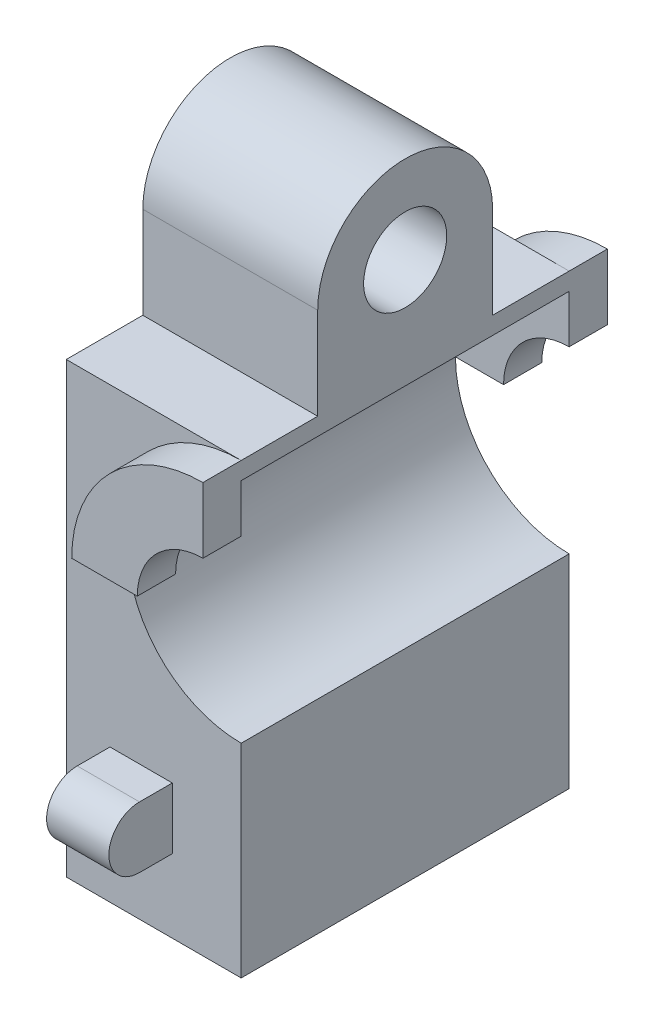
ISO-10303-21;
HEADER;
FILE_DESCRIPTION(('STEP AP214'),'2;1');
FILE_NAME('part.step','',(''),(''),'','','');
FILE_SCHEMA(('AUTOMOTIVE_DESIGN { 1 0 10303 214 1 1 1 1 }'));
ENDSEC;
DATA;
#1=APPLICATION_CONTEXT('core data for automotive mechanical design processes');
#2=APPLICATION_PROTOCOL_DEFINITION('international standard','automotive_design',2000,#1);
#3=PRODUCT_CONTEXT('',#1,'mechanical');
#4=PRODUCT('Part','Part','',(#3));
#5=PRODUCT_RELATED_PRODUCT_CATEGORY('part','',(#4));
#6=PRODUCT_DEFINITION_FORMATION('','',#4);
#7=PRODUCT_DEFINITION_CONTEXT('part definition',#1,'design');
#8=PRODUCT_DEFINITION('design','',#6,#7);
#9=PRODUCT_DEFINITION_SHAPE('','',#8);
#10=(LENGTH_UNIT() NAMED_UNIT(*) SI_UNIT(.MILLI.,.METRE.));
#11=(NAMED_UNIT(*) PLANE_ANGLE_UNIT() SI_UNIT($,.RADIAN.));
#12=(NAMED_UNIT(*) SI_UNIT($,.STERADIAN.) SOLID_ANGLE_UNIT());
#13=UNCERTAINTY_MEASURE_WITH_UNIT(LENGTH_MEASURE(1.E-05),#10,'distance_accuracy_value','');
#14=(GEOMETRIC_REPRESENTATION_CONTEXT(3) GLOBAL_UNCERTAINTY_ASSIGNED_CONTEXT((#13)) GLOBAL_UNIT_ASSIGNED_CONTEXT((#10,
#11,#12)) REPRESENTATION_CONTEXT('',''));
#15=CARTESIAN_POINT('',(0.,0.,0.));
#16=DIRECTION('',(0.,0.,1.));
#17=DIRECTION('',(1.,0.,0.));
#18=AXIS2_PLACEMENT_3D('',#15,#16,#17);
#19=CARTESIAN_POINT('',(0.,0.,15.));
#20=DIRECTION('',(0.,0.,-1.));
#21=DIRECTION('',(-1.,0.,0.));
#22=AXIS2_PLACEMENT_3D('',#19,#20,#21);
#23=CYLINDRICAL_SURFACE('',#22,6.);
#24=CARTESIAN_POINT('',(0.,0.,15.));
#25=DIRECTION('',(0.,0.,1.));
#26=DIRECTION('',(1.,0.,0.));
#27=AXIS2_PLACEMENT_3D('',#24,#25,#26);
#28=CIRCLE('',#27,6.);
#29=CARTESIAN_POINT('',(-6.,0.,15.));
#30=VERTEX_POINT('',#29);
#31=CARTESIAN_POINT('',(0.,6.,15.));
#32=VERTEX_POINT('',#31);
#33=EDGE_CURVE('E228',#30,#32,#28,.F.);
#34=ORIENTED_EDGE('',*,*,#33,.F.);
#35=DIRECTION('',(0.,0.,1.));
#36=VECTOR('',#35,1.);
#37=CARTESIAN_POINT('',(-6.,0.,15.));
#38=LINE('',#37,#36);
#39=CARTESIAN_POINT('',(-6.,0.,16.75));
#40=VERTEX_POINT('',#39);
#41=EDGE_CURVE('E289',#30,#40,#38,.T.);
#42=ORIENTED_EDGE('',*,*,#41,.T.);
#43=CARTESIAN_POINT('',(0.,0.,16.75));
#44=DIRECTION('',(0.,0.,-1.));
#45=DIRECTION('',(-1.,0.,0.));
#46=AXIS2_PLACEMENT_3D('',#43,#44,#45);
#47=CIRCLE('',#46,6.);
#48=CARTESIAN_POINT('',(0.,6.,16.75));
#49=VERTEX_POINT('',#48);
#50=EDGE_CURVE('E302',#40,#49,#47,.T.);
#51=ORIENTED_EDGE('',*,*,#50,.T.);
#52=DIRECTION('',(0.,0.,-1.));
#53=VECTOR('',#52,1.);
#54=CARTESIAN_POINT('',(0.,6.,15.));
#55=LINE('',#54,#53);
#56=EDGE_CURVE('E11',#49,#32,#55,.T.);
#57=ORIENTED_EDGE('',*,*,#56,.T.);
#58=EDGE_LOOP('',(#34,#42,#51,#57));
#59=FACE_BOUND('',#58,.T.);
#60=ADVANCED_FACE('F47',(#59),#23,.T.);
#61=CARTESIAN_POINT('',(0.,0.,0.));
#62=DIRECTION('',(0.,0.,-1.));
#63=DIRECTION('',(-1.,0.,0.));
#64=AXIS2_PLACEMENT_3D('',#61,#62,#63);
#65=CIRCLE('',#64,6.);
#66=CARTESIAN_POINT('',(0.,6.,0.));
#67=VERTEX_POINT('',#66);
#68=CARTESIAN_POINT('',(-6.,0.,0.));
#69=VERTEX_POINT('',#68);
#70=EDGE_CURVE('E70',#67,#69,#65,.F.);
#71=ORIENTED_EDGE('',*,*,#70,.F.);
#72=CARTESIAN_POINT('',(0.,6.,-1.75));
#73=VERTEX_POINT('',#72);
#74=EDGE_CURVE('E56',#67,#73,#55,.T.);
#75=ORIENTED_EDGE('',*,*,#74,.T.);
#76=CARTESIAN_POINT('',(0.,0.,-1.75));
#77=DIRECTION('',(0.,0.,-1.));
#78=DIRECTION('',(-1.,0.,0.));
#79=AXIS2_PLACEMENT_3D('',#76,#77,#78);
#80=CIRCLE('',#79,6.);
#81=CARTESIAN_POINT('',(-6.,0.,-1.75));
#82=VERTEX_POINT('',#81);
#83=EDGE_CURVE('E327',#82,#73,#80,.T.);
#84=ORIENTED_EDGE('',*,*,#83,.F.);
#85=DIRECTION('',(0.,0.,1.));
#86=VECTOR('',#85,1.);
#87=CARTESIAN_POINT('',(-6.,0.,0.));
#88=LINE('',#87,#86);
#89=EDGE_CURVE('E319',#82,#69,#88,.T.);
#90=ORIENTED_EDGE('',*,*,#89,.T.);
#91=EDGE_LOOP('',(#71,#75,#84,#90));
#92=FACE_BOUND('',#91,.T.);
#93=ADVANCED_FACE('F488',(#92),#23,.T.);
#94=CARTESIAN_POINT('',(-6.,-14.5,15.));
#95=DIRECTION('',(1.,0.,0.));
#96=DIRECTION('',(0.,0.,-1.));
#97=AXIS2_PLACEMENT_3D('',#94,#95,#96);
#98=PLANE('',#97);
#99=DIRECTION('',(0.,-1.,0.));
#100=VECTOR('',#99,1.);
#101=CARTESIAN_POINT('',(-6.,0.,0.));
#102=LINE('',#101,#100);
#103=CARTESIAN_POINT('',(-6.,-8.35,0.));
#104=VERTEX_POINT('',#103);
#105=CARTESIAN_POINT('',(-6.,-11.15,0.));
#106=VERTEX_POINT('',#105);
#107=EDGE_CURVE('E248',#104,#106,#102,.T.);
#108=ORIENTED_EDGE('',*,*,#107,.F.);
#109=DIRECTION('',(0.,0.,-1.));
#110=VECTOR('',#109,1.);
#111=CARTESIAN_POINT('',(-6.,-8.35,0.));
#112=LINE('',#111,#110);
#113=CARTESIAN_POINT('',(-6.,-8.35,-1.5));
#114=VERTEX_POINT('',#113);
#115=EDGE_CURVE('E372',#104,#114,#112,.T.);
#116=ORIENTED_EDGE('',*,*,#115,.T.);
#117=CARTESIAN_POINT('',(-6.,-9.75,-1.5));
#118=DIRECTION('',(-1.,0.,0.));
#119=DIRECTION('',(0.,0.,1.));
#120=AXIS2_PLACEMENT_3D('',#117,#118,#119);
#121=CIRCLE('',#120,1.4);
#122=CARTESIAN_POINT('',(-6.,-11.15,-1.5));
#123=VERTEX_POINT('',#122);
#124=EDGE_CURVE('E375',#114,#123,#121,.T.);
#125=ORIENTED_EDGE('',*,*,#124,.T.);
#126=DIRECTION('',(0.,0.,-1.));
#127=VECTOR('',#126,1.);
#128=CARTESIAN_POINT('',(-6.,-11.15,0.));
#129=LINE('',#128,#127);
#130=EDGE_CURVE('E364',#106,#123,#129,.T.);
#131=ORIENTED_EDGE('',*,*,#130,.F.);
#132=EDGE_LOOP('',(#108,#116,#125,#131));
#133=FACE_BOUND('',#132,.T.);
#134=ADVANCED_FACE('F490',(#133),#98,.F.);
#135=DIRECTION('',(0.,1.,0.));
#136=VECTOR('',#135,1.);
#137=CARTESIAN_POINT('',(-6.,0.,15.));
#138=LINE('',#137,#136);
#139=CARTESIAN_POINT('',(-6.,-11.15,15.));
#140=VERTEX_POINT('',#139);
#141=CARTESIAN_POINT('',(-6.,-8.35,15.));
#142=VERTEX_POINT('',#141);
#143=EDGE_CURVE('E245',#140,#142,#138,.T.);
#144=ORIENTED_EDGE('',*,*,#143,.F.);
#145=DIRECTION('',(0.,0.,1.));
#146=VECTOR('',#145,1.);
#147=CARTESIAN_POINT('',(-6.,-11.15,0.));
#148=LINE('',#147,#146);
#149=CARTESIAN_POINT('',(-6.,-11.15,16.5));
#150=VERTEX_POINT('',#149);
#151=EDGE_CURVE('E393',#140,#150,#148,.T.);
#152=ORIENTED_EDGE('',*,*,#151,.T.);
#153=CARTESIAN_POINT('',(-6.,-9.75,16.5));
#154=DIRECTION('',(-1.,0.,0.));
#155=DIRECTION('',(0.,0.,1.));
#156=AXIS2_PLACEMENT_3D('',#153,#154,#155);
#157=CIRCLE('',#156,1.4);
#158=CARTESIAN_POINT('',(-6.,-8.35,16.5));
#159=VERTEX_POINT('',#158);
#160=EDGE_CURVE('E352',#159,#150,#157,.F.);
#161=ORIENTED_EDGE('',*,*,#160,.F.);
#162=DIRECTION('',(0.,0.,1.));
#163=VECTOR('',#162,1.);
#164=CARTESIAN_POINT('',(-6.,-8.35000000000002,0.));
#165=LINE('',#164,#163);
#166=EDGE_CURVE('E403',#142,#159,#165,.T.);
#167=ORIENTED_EDGE('',*,*,#166,.F.);
#168=EDGE_LOOP('',(#144,#152,#161,#167));
#169=FACE_BOUND('',#168,.T.);
#170=ADVANCED_FACE('F495',(#169),#98,.F.);
#171=CARTESIAN_POINT('',(-6.,-14.501,11.5));
#172=DIRECTION('',(0.,0.,-1.));
#173=DIRECTION('',(-1.,0.,0.));
#174=AXIS2_PLACEMENT_3D('',#171,#172,#173);
#175=PLANE('',#174);
#176=DIRECTION('',(-1.,0.,0.));
#177=VECTOR('',#176,1.);
#178=CARTESIAN_POINT('',(0.00200000000000027,6.,11.5));
#179=LINE('',#178,#177);
#180=CARTESIAN_POINT('',(0.,6.,11.5));
#181=VERTEX_POINT('',#180);
#182=CARTESIAN_POINT('',(-8.,6.,11.5));
#183=VERTEX_POINT('',#182);
#184=EDGE_CURVE('E220',#181,#183,#179,.T.);
#185=ORIENTED_EDGE('',*,*,#184,.F.);
#186=DIRECTION('',(0.,1.,0.));
#187=VECTOR('',#186,1.);
#188=CARTESIAN_POINT('',(0.,0.,11.5));
#189=LINE('',#188,#187);
#190=CARTESIAN_POINT('',(0.,10.2,11.5));
#191=VERTEX_POINT('',#190);
#192=EDGE_CURVE('E346',#181,#191,#189,.T.);
#193=ORIENTED_EDGE('',*,*,#192,.T.);
#194=DIRECTION('',(1.,0.,0.));
#195=VECTOR('',#194,1.);
#196=CARTESIAN_POINT('',(-17.4560027932957,10.2,11.5));
#197=LINE('',#196,#195);
#198=CARTESIAN_POINT('',(-8.,10.2,11.5));
#199=VERTEX_POINT('',#198);
#200=EDGE_CURVE('E233',#199,#191,#197,.T.);
#201=ORIENTED_EDGE('',*,*,#200,.F.);
#202=DIRECTION('',(0.,1.,0.));
#203=VECTOR('',#202,1.);
#204=CARTESIAN_POINT('',(-8.,0.,11.5));
#205=LINE('',#204,#203);
#206=EDGE_CURVE('E231',#183,#199,#205,.T.);
#207=ORIENTED_EDGE('',*,*,#206,.F.);
#208=EDGE_LOOP('',(#185,#193,#201,#207));
#209=FACE_BOUND('',#208,.T.);
#210=ADVANCED_FACE('F232',(#209),#175,.F.);
#211=CARTESIAN_POINT('',(0.,-14.501,3.5));
#212=DIRECTION('',(0.,0.,1.));
#213=DIRECTION('',(1.,0.,0.));
#214=AXIS2_PLACEMENT_3D('',#211,#212,#213);
#215=PLANE('',#214);
#216=DIRECTION('',(0.,1.,0.));
#217=VECTOR('',#216,1.);
#218=CARTESIAN_POINT('',(0.,0.,3.5));
#219=LINE('',#218,#217);
#220=CARTESIAN_POINT('',(0.,6.,3.5));
#221=VERTEX_POINT('',#220);
#222=CARTESIAN_POINT('',(0.,10.2,3.5));
#223=VERTEX_POINT('',#222);
#224=EDGE_CURVE('E353',#221,#223,#219,.T.);
#225=ORIENTED_EDGE('',*,*,#224,.F.);
#226=DIRECTION('',(1.,0.,0.));
#227=VECTOR('',#226,1.);
#228=CARTESIAN_POINT('',(-8.,6.,3.5));
#229=LINE('',#228,#227);
#230=CARTESIAN_POINT('',(-8.,6.,3.5));
#231=VERTEX_POINT('',#230);
#232=EDGE_CURVE('E273',#231,#221,#229,.T.);
#233=ORIENTED_EDGE('',*,*,#232,.F.);
#234=DIRECTION('',(0.,-1.,0.));
#235=VECTOR('',#234,1.);
#236=CARTESIAN_POINT('',(-8.,0.,3.5));
#237=LINE('',#236,#235);
#238=CARTESIAN_POINT('',(-8.,10.2,3.5));
#239=VERTEX_POINT('',#238);
#240=EDGE_CURVE('E253',#239,#231,#237,.T.);
#241=ORIENTED_EDGE('',*,*,#240,.F.);
#242=DIRECTION('',(1.,0.,0.));
#243=VECTOR('',#242,1.);
#244=CARTESIAN_POINT('',(-17.4560027932957,10.2,3.5));
#245=LINE('',#244,#243);
#246=EDGE_CURVE('E345',#239,#223,#245,.T.);
#247=ORIENTED_EDGE('',*,*,#246,.T.);
#248=EDGE_LOOP('',(#225,#233,#241,#247));
#249=FACE_BOUND('',#248,.T.);
#250=ADVANCED_FACE('F510',(#249),#215,.F.);
#251=CARTESIAN_POINT('',(0.,0.,15.));
#252=DIRECTION('',(0.,0.,1.));
#253=DIRECTION('',(1.,0.,0.));
#254=AXIS2_PLACEMENT_3D('',#251,#252,#253);
#255=PLANE('',#254);
#256=DIRECTION('',(0.,1.,0.));
#257=VECTOR('',#256,1.);
#258=CARTESIAN_POINT('',(-8.,0.,15.));
#259=LINE('',#258,#257);
#260=CARTESIAN_POINT('',(-8.,-14.5,15.));
#261=VERTEX_POINT('',#260);
#262=CARTESIAN_POINT('',(-8.,6.,15.));
#263=VERTEX_POINT('',#262);
#264=EDGE_CURVE('E243',#261,#263,#259,.T.);
#265=ORIENTED_EDGE('',*,*,#264,.F.);
#266=DIRECTION('',(1.,0.,0.));
#267=VECTOR('',#266,1.);
#268=CARTESIAN_POINT('',(0.,-14.5,15.));
#269=LINE('',#268,#267);
#270=CARTESIAN_POINT('',(0.,-14.5,15.));
#271=VERTEX_POINT('',#270);
#272=EDGE_CURVE('E415',#261,#271,#269,.T.);
#273=ORIENTED_EDGE('',*,*,#272,.T.);
#274=DIRECTION('',(0.,1.,0.));
#275=VECTOR('',#274,1.);
#276=CARTESIAN_POINT('',(0.,-5.,15.));
#277=LINE('',#276,#275);
#278=CARTESIAN_POINT('',(0.,-5.2,15.));
#279=VERTEX_POINT('',#278);
#280=EDGE_CURVE('E417',#271,#279,#277,.T.);
#281=ORIENTED_EDGE('',*,*,#280,.T.);
#282=CARTESIAN_POINT('',(0.,0.,15.));
#283=DIRECTION('',(0.,0.,1.));
#284=DIRECTION('',(1.,0.,0.));
#285=AXIS2_PLACEMENT_3D('',#282,#283,#284);
#286=CIRCLE('',#285,5.2);
#287=CARTESIAN_POINT('',(-5.2,0.,15.));
#288=VERTEX_POINT('',#287);
#289=EDGE_CURVE('E305',#288,#279,#286,.T.);
#290=ORIENTED_EDGE('',*,*,#289,.F.);
#291=DIRECTION('',(-1.,0.,0.));
#292=VECTOR('',#291,1.);
#293=CARTESIAN_POINT('',(-3.,0.,15.));
#294=LINE('',#293,#292);
#295=EDGE_CURVE('E286',#288,#30,#294,.T.);
#296=ORIENTED_EDGE('',*,*,#295,.T.);
#297=ORIENTED_EDGE('',*,*,#33,.T.);
#298=DIRECTION('',(1.,0.,0.));
#299=VECTOR('',#298,1.);
#300=CARTESIAN_POINT('',(-8.,6.,15.));
#301=LINE('',#300,#299);
#302=EDGE_CURVE('E266',#263,#32,#301,.T.);
#303=ORIENTED_EDGE('',*,*,#302,.F.);
#304=EDGE_LOOP('',(#265,#273,#281,#290,#296,#297,#303));
#305=FACE_BOUND('',#304,.T.);
#306=DIRECTION('',(-1.,0.,0.));
#307=VECTOR('',#306,1.);
#308=CARTESIAN_POINT('',(-3.15,-11.15,15.));
#309=LINE('',#308,#307);
#310=CARTESIAN_POINT('',(-3.15,-11.15,15.));
#311=VERTEX_POINT('',#310);
#312=EDGE_CURVE('E408',#311,#140,#309,.T.);
#313=ORIENTED_EDGE('',*,*,#312,.T.);
#314=ORIENTED_EDGE('',*,*,#143,.T.);
#315=DIRECTION('',(-1.,0.,0.));
#316=VECTOR('',#315,1.);
#317=CARTESIAN_POINT('',(-3.15,-8.35,15.));
#318=LINE('',#317,#316);
#319=CARTESIAN_POINT('',(-3.15,-8.35,15.));
#320=VERTEX_POINT('',#319);
#321=EDGE_CURVE('E411',#320,#142,#318,.T.);
#322=ORIENTED_EDGE('',*,*,#321,.F.);
#323=DIRECTION('',(0.,1.,0.));
#324=VECTOR('',#323,1.);
#325=CARTESIAN_POINT('',(-3.15,0.,15.));
#326=LINE('',#325,#324);
#327=EDGE_CURVE('E395',#311,#320,#326,.T.);
#328=ORIENTED_EDGE('',*,*,#327,.F.);
#329=EDGE_LOOP('',(#313,#314,#322,#328));
#330=FACE_BOUND('',#329,.T.);
#331=ADVANCED_FACE('F446',(#305,#330),#255,.T.);
#332=CARTESIAN_POINT('',(0.,6.,15.));
#333=DIRECTION('',(-1.,0.,0.));
#334=DIRECTION('',(0.,0.,1.));
#335=AXIS2_PLACEMENT_3D('',#332,#333,#334);
#336=PLANE('',#335);
#337=CARTESIAN_POINT('',(0.,10.2,7.5));
#338=DIRECTION('',(1.,0.,0.));
#339=DIRECTION('',(0.,0.,-1.));
#340=AXIS2_PLACEMENT_3D('',#337,#338,#339);
#341=CIRCLE('',#340,1.9);
#342=CARTESIAN_POINT('',(0.,10.2,5.6));
#343=VERTEX_POINT('',#342);
#344=EDGE_CURVE('E348',#343,#343,#341,.T.);
#345=ORIENTED_EDGE('',*,*,#344,.F.);
#346=EDGE_LOOP('',(#345));
#347=FACE_BOUND('',#346,.T.);
#348=DIRECTION('',(0.,0.,1.));
#349=VECTOR('',#348,1.);
#350=CARTESIAN_POINT('',(0.,5.2,15.));
#351=LINE('',#350,#349);
#352=CARTESIAN_POINT('',(0.,5.2,0.));
#353=VERTEX_POINT('',#352);
#354=CARTESIAN_POINT('',(0.,5.2,15.));
#355=VERTEX_POINT('',#354);
#356=EDGE_CURVE('E342',#353,#355,#351,.T.);
#357=ORIENTED_EDGE('',*,*,#356,.F.);
#358=DIRECTION('',(0.,-1.,0.));
#359=VECTOR('',#358,1.);
#360=CARTESIAN_POINT('',(0.,3.,0.));
#361=LINE('',#360,#359);
#362=CARTESIAN_POINT('',(0.,3.,0.));
#363=VERTEX_POINT('',#362);
#364=EDGE_CURVE('E311',#353,#363,#361,.T.);
#365=ORIENTED_EDGE('',*,*,#364,.T.);
#366=DIRECTION('',(0.,0.,-1.));
#367=VECTOR('',#366,1.);
#368=CARTESIAN_POINT('',(0.,3.,-1.75));
#369=LINE('',#368,#367);
#370=CARTESIAN_POINT('',(0.,3.,-1.75));
#371=VERTEX_POINT('',#370);
#372=EDGE_CURVE('E275',#363,#371,#369,.T.);
#373=ORIENTED_EDGE('',*,*,#372,.T.);
#374=DIRECTION('',(0.,1.,0.));
#375=VECTOR('',#374,1.);
#376=CARTESIAN_POINT('',(0.,6.,-1.75));
#377=LINE('',#376,#375);
#378=EDGE_CURVE('E308',#371,#73,#377,.T.);
#379=ORIENTED_EDGE('',*,*,#378,.T.);
#380=ORIENTED_EDGE('',*,*,#74,.F.);
#381=EDGE_CURVE('E55',#221,#67,#55,.T.);
#382=ORIENTED_EDGE('',*,*,#381,.F.);
#383=ORIENTED_EDGE('',*,*,#224,.T.);
#384=CARTESIAN_POINT('',(0.,10.2,7.5));
#385=DIRECTION('',(1.,0.,0.));
#386=DIRECTION('',(0.,0.,-1.));
#387=AXIS2_PLACEMENT_3D('',#384,#385,#386);
#388=CIRCLE('',#387,4.);
#389=EDGE_CURVE('E349',#223,#191,#388,.T.);
#390=ORIENTED_EDGE('',*,*,#389,.T.);
#391=ORIENTED_EDGE('',*,*,#192,.F.);
#392=DIRECTION('',(0.,0.,1.));
#393=VECTOR('',#392,1.);
#394=CARTESIAN_POINT('',(0.,6.,0.));
#395=LINE('',#394,#393);
#396=EDGE_CURVE('E63',#181,#32,#395,.T.);
#397=ORIENTED_EDGE('',*,*,#396,.T.);
#398=ORIENTED_EDGE('',*,*,#56,.F.);
#399=DIRECTION('',(0.,-1.,0.));
#400=VECTOR('',#399,1.);
#401=CARTESIAN_POINT('',(0.,6.,16.75));
#402=LINE('',#401,#400);
#403=CARTESIAN_POINT('',(0.,3.,16.75));
#404=VERTEX_POINT('',#403);
#405=EDGE_CURVE('E279',#49,#404,#402,.T.);
#406=ORIENTED_EDGE('',*,*,#405,.T.);
#407=DIRECTION('',(0.,0.,-1.));
#408=VECTOR('',#407,1.);
#409=CARTESIAN_POINT('',(0.,3.,16.75));
#410=LINE('',#409,#408);
#411=CARTESIAN_POINT('',(0.,3.,15.));
#412=VERTEX_POINT('',#411);
#413=EDGE_CURVE('E283',#404,#412,#410,.T.);
#414=ORIENTED_EDGE('',*,*,#413,.T.);
#415=DIRECTION('',(0.,1.,0.));
#416=VECTOR('',#415,1.);
#417=CARTESIAN_POINT('',(0.,3.,15.));
#418=LINE('',#417,#416);
#419=EDGE_CURVE('E276',#412,#355,#418,.T.);
#420=ORIENTED_EDGE('',*,*,#419,.T.);
#421=EDGE_LOOP('',(#357,#365,#373,#379,#380,#382,#383,#390,#391,#397,#398,#406,#414,#420));
#422=FACE_BOUND('',#421,.T.);
#423=ADVANCED_FACE('F49',(#347,#422),#336,.F.);
#424=CARTESIAN_POINT('',(0.,-5.,15.));
#425=DIRECTION('',(-1.,0.,0.));
#426=DIRECTION('',(0.,-1.,0.));
#427=AXIS2_PLACEMENT_3D('',#424,#425,#426);
#428=PLANE('',#427);
#429=DIRECTION('',(0.,0.,1.));
#430=VECTOR('',#429,1.);
#431=CARTESIAN_POINT('',(0.,-5.2,15.));
#432=LINE('',#431,#430);
#433=CARTESIAN_POINT('',(0.,-5.2,0.));
#434=VERTEX_POINT('',#433);
#435=EDGE_CURVE('E339',#279,#434,#432,.F.);
#436=ORIENTED_EDGE('',*,*,#435,.F.);
#437=ORIENTED_EDGE('',*,*,#280,.F.);
#438=DIRECTION('',(0.,0.,-1.));
#439=VECTOR('',#438,1.);
#440=CARTESIAN_POINT('',(0.,-14.5,15.));
#441=LINE('',#440,#439);
#442=CARTESIAN_POINT('',(0.,-14.5,0.));
#443=VERTEX_POINT('',#442);
#444=EDGE_CURVE('E421',#271,#443,#441,.T.);
#445=ORIENTED_EDGE('',*,*,#444,.T.);
#446=DIRECTION('',(0.,1.,0.));
#447=VECTOR('',#446,1.);
#448=CARTESIAN_POINT('',(0.,-5.,0.));
#449=LINE('',#448,#447);
#450=EDGE_CURVE('E418',#443,#434,#449,.T.);
#451=ORIENTED_EDGE('',*,*,#450,.T.);
#452=EDGE_LOOP('',(#436,#437,#445,#451));
#453=FACE_BOUND('',#452,.T.);
#454=ADVANCED_FACE('F502',(#453),#428,.F.);
#455=CARTESIAN_POINT('',(0.,0.,0.));
#456=DIRECTION('',(0.,0.,1.));
#457=DIRECTION('',(1.,0.,0.));
#458=AXIS2_PLACEMENT_3D('',#455,#456,#457);
#459=PLANE('',#458);
#460=DIRECTION('',(-1.,0.,0.));
#461=VECTOR('',#460,1.);
#462=CARTESIAN_POINT('',(-3.15,-8.35,0.));
#463=LINE('',#462,#461);
#464=CARTESIAN_POINT('',(-3.15,-8.35,0.));
#465=VERTEX_POINT('',#464);
#466=EDGE_CURVE('E381',#465,#104,#463,.T.);
#467=ORIENTED_EDGE('',*,*,#466,.T.);
#468=ORIENTED_EDGE('',*,*,#107,.T.);
#469=DIRECTION('',(-1.,0.,0.));
#470=VECTOR('',#469,1.);
#471=CARTESIAN_POINT('',(-3.15,-11.15,0.));
#472=LINE('',#471,#470);
#473=CARTESIAN_POINT('',(-3.15,-11.15,0.));
#474=VERTEX_POINT('',#473);
#475=EDGE_CURVE('E385',#474,#106,#472,.T.);
#476=ORIENTED_EDGE('',*,*,#475,.F.);
#477=DIRECTION('',(0.,-1.,0.));
#478=VECTOR('',#477,1.);
#479=CARTESIAN_POINT('',(-3.15,0.,0.));
#480=LINE('',#479,#478);
#481=EDGE_CURVE('E369',#465,#474,#480,.T.);
#482=ORIENTED_EDGE('',*,*,#481,.F.);
#483=EDGE_LOOP('',(#467,#468,#476,#482));
#484=FACE_BOUND('',#483,.T.);
#485=ORIENTED_EDGE('',*,*,#70,.T.);
#486=DIRECTION('',(1.,0.,0.));
#487=VECTOR('',#486,1.);
#488=CARTESIAN_POINT('',(-3.,0.,0.));
#489=LINE('',#488,#487);
#490=CARTESIAN_POINT('',(-5.2,0.,0.));
#491=VERTEX_POINT('',#490);
#492=EDGE_CURVE('E322',#69,#491,#489,.T.);
#493=ORIENTED_EDGE('',*,*,#492,.T.);
#494=CARTESIAN_POINT('',(0.,0.,0.));
#495=DIRECTION('',(0.,0.,1.));
#496=DIRECTION('',(1.,0.,0.));
#497=AXIS2_PLACEMENT_3D('',#494,#495,#496);
#498=CIRCLE('',#497,5.2);
#499=EDGE_CURVE('E335',#491,#434,#498,.T.);
#500=ORIENTED_EDGE('',*,*,#499,.T.);
#501=ORIENTED_EDGE('',*,*,#450,.F.);
#502=DIRECTION('',(1.,0.,0.));
#503=VECTOR('',#502,1.);
#504=CARTESIAN_POINT('',(0.,-14.5,0.));
#505=LINE('',#504,#503);
#506=CARTESIAN_POINT('',(-8.,-14.5,0.));
#507=VERTEX_POINT('',#506);
#508=EDGE_CURVE('E384',#507,#443,#505,.T.);
#509=ORIENTED_EDGE('',*,*,#508,.F.);
#510=DIRECTION('',(0.,-1.,0.));
#511=VECTOR('',#510,1.);
#512=CARTESIAN_POINT('',(-8.,0.,0.));
#513=LINE('',#512,#511);
#514=CARTESIAN_POINT('',(-8.,6.,0.));
#515=VERTEX_POINT('',#514);
#516=EDGE_CURVE('E257',#515,#507,#513,.T.);
#517=ORIENTED_EDGE('',*,*,#516,.F.);
#518=DIRECTION('',(1.,0.,0.));
#519=VECTOR('',#518,1.);
#520=CARTESIAN_POINT('',(-8.,6.,0.));
#521=LINE('',#520,#519);
#522=EDGE_CURVE('E270',#515,#67,#521,.T.);
#523=ORIENTED_EDGE('',*,*,#522,.T.);
#524=EDGE_LOOP('',(#485,#493,#500,#501,#509,#517,#523));
#525=FACE_BOUND('',#524,.T.);
#526=ADVANCED_FACE('F441',(#484,#525),#459,.F.);
#527=CARTESIAN_POINT('',(0.,-14.5,15.));
#528=DIRECTION('',(0.,1.,0.));
#529=DIRECTION('',(0.,0.,1.));
#530=AXIS2_PLACEMENT_3D('',#527,#528,#529);
#531=PLANE('',#530);
#532=ORIENTED_EDGE('',*,*,#508,.T.);
#533=ORIENTED_EDGE('',*,*,#444,.F.);
#534=ORIENTED_EDGE('',*,*,#272,.F.);
#535=DIRECTION('',(0.,0.,1.));
#536=VECTOR('',#535,1.);
#537=CARTESIAN_POINT('',(-8.,-14.5,0.));
#538=LINE('',#537,#536);
#539=EDGE_CURVE('E260',#507,#261,#538,.T.);
#540=ORIENTED_EDGE('',*,*,#539,.F.);
#541=EDGE_LOOP('',(#532,#533,#534,#540));
#542=FACE_BOUND('',#541,.T.);
#543=ADVANCED_FACE('F444',(#542),#531,.F.);
#544=CARTESIAN_POINT('',(-3.15,-8.35,0.));
#545=DIRECTION('',(0.,1.,0.));
#546=DIRECTION('',(0.,0.,1.));
#547=AXIS2_PLACEMENT_3D('',#544,#545,#546);
#548=PLANE('',#547);
#549=ORIENTED_EDGE('',*,*,#115,.F.);
#550=ORIENTED_EDGE('',*,*,#466,.F.);
#551=DIRECTION('',(0.,0.,-1.));
#552=VECTOR('',#551,1.);
#553=CARTESIAN_POINT('',(-3.15,-8.35,0.));
#554=LINE('',#553,#552);
#555=CARTESIAN_POINT('',(-3.15,-8.35,-1.5));
#556=VERTEX_POINT('',#555);
#557=EDGE_CURVE('E360',#465,#556,#554,.T.);
#558=ORIENTED_EDGE('',*,*,#557,.T.);
#559=DIRECTION('',(-1.,0.,0.));
#560=VECTOR('',#559,1.);
#561=CARTESIAN_POINT('',(-3.15,-8.35,-1.5));
#562=LINE('',#561,#560);
#563=EDGE_CURVE('E371',#556,#114,#562,.T.);
#564=ORIENTED_EDGE('',*,*,#563,.T.);
#565=EDGE_LOOP('',(#549,#550,#558,#564));
#566=FACE_BOUND('',#565,.T.);
#567=ADVANCED_FACE('F501',(#566),#548,.T.);
#568=CARTESIAN_POINT('',(-3.15,-11.15,0.));
#569=DIRECTION('',(0.,1.,0.));
#570=DIRECTION('',(0.,0.,1.));
#571=AXIS2_PLACEMENT_3D('',#568,#569,#570);
#572=PLANE('',#571);
#573=ORIENTED_EDGE('',*,*,#130,.T.);
#574=DIRECTION('',(-1.,0.,0.));
#575=VECTOR('',#574,1.);
#576=CARTESIAN_POINT('',(-3.15,-11.15,-1.5));
#577=LINE('',#576,#575);
#578=CARTESIAN_POINT('',(-3.15,-11.15,-1.5));
#579=VERTEX_POINT('',#578);
#580=EDGE_CURVE('E387',#579,#123,#577,.T.);
#581=ORIENTED_EDGE('',*,*,#580,.F.);
#582=DIRECTION('',(0.,0.,-1.));
#583=VECTOR('',#582,1.);
#584=CARTESIAN_POINT('',(-3.15,-11.15,0.));
#585=LINE('',#584,#583);
#586=EDGE_CURVE('E367',#474,#579,#585,.T.);
#587=ORIENTED_EDGE('',*,*,#586,.F.);
#588=ORIENTED_EDGE('',*,*,#475,.T.);
#589=EDGE_LOOP('',(#573,#581,#587,#588));
#590=FACE_BOUND('',#589,.T.);
#591=ADVANCED_FACE('F531',(#590),#572,.F.);
#592=CARTESIAN_POINT('',(-3.15,-9.75,-1.5));
#593=DIRECTION('',(-1.,0.,0.));
#594=DIRECTION('',(0.,0.,1.));
#595=AXIS2_PLACEMENT_3D('',#592,#593,#594);
#596=CYLINDRICAL_SURFACE('',#595,1.4);
#597=ORIENTED_EDGE('',*,*,#124,.F.);
#598=ORIENTED_EDGE('',*,*,#563,.F.);
#599=CARTESIAN_POINT('',(-3.15,-9.75,-1.5));
#600=DIRECTION('',(-1.,0.,0.));
#601=DIRECTION('',(0.,0.,1.));
#602=AXIS2_PLACEMENT_3D('',#599,#600,#601);
#603=CIRCLE('',#602,1.4);
#604=EDGE_CURVE('E363',#556,#579,#603,.T.);
#605=ORIENTED_EDGE('',*,*,#604,.T.);
#606=ORIENTED_EDGE('',*,*,#580,.T.);
#607=EDGE_LOOP('',(#597,#598,#605,#606));
#608=FACE_BOUND('',#607,.T.);
#609=ADVANCED_FACE('F533',(#608),#596,.T.);
#610=CARTESIAN_POINT('',(-3.15,0.,0.));
#611=DIRECTION('',(-1.,0.,0.));
#612=DIRECTION('',(0.,0.,1.));
#613=AXIS2_PLACEMENT_3D('',#610,#611,#612);
#614=PLANE('',#613);
#615=ORIENTED_EDGE('',*,*,#557,.F.);
#616=ORIENTED_EDGE('',*,*,#481,.T.);
#617=ORIENTED_EDGE('',*,*,#586,.T.);
#618=ORIENTED_EDGE('',*,*,#604,.F.);
#619=EDGE_LOOP('',(#615,#616,#617,#618));
#620=FACE_BOUND('',#619,.T.);
#621=ADVANCED_FACE('F515',(#620),#614,.F.);
#622=CARTESIAN_POINT('',(-3.15,-9.75,16.5));
#623=DIRECTION('',(-1.,0.,0.));
#624=DIRECTION('',(0.,0.,1.));
#625=AXIS2_PLACEMENT_3D('',#622,#623,#624);
#626=CYLINDRICAL_SURFACE('',#625,1.4);
#627=ORIENTED_EDGE('',*,*,#160,.T.);
#628=DIRECTION('',(-1.,0.,0.));
#629=VECTOR('',#628,1.);
#630=CARTESIAN_POINT('',(-3.15,-11.15,16.5));
#631=LINE('',#630,#629);
#632=CARTESIAN_POINT('',(-3.15,-11.15,16.5));
#633=VERTEX_POINT('',#632);
#634=EDGE_CURVE('E376',#633,#150,#631,.T.);
#635=ORIENTED_EDGE('',*,*,#634,.F.);
#636=CARTESIAN_POINT('',(-3.15,-9.75,16.5));
#637=DIRECTION('',(-1.,0.,0.));
#638=DIRECTION('',(0.,0.,1.));
#639=AXIS2_PLACEMENT_3D('',#636,#637,#638);
#640=CIRCLE('',#639,1.4);
#641=CARTESIAN_POINT('',(-3.15,-8.35,16.5));
#642=VERTEX_POINT('',#641);
#643=EDGE_CURVE('E390',#642,#633,#640,.F.);
#644=ORIENTED_EDGE('',*,*,#643,.F.);
#645=DIRECTION('',(-1.,0.,0.));
#646=VECTOR('',#645,1.);
#647=CARTESIAN_POINT('',(-3.15,-8.35,16.5));
#648=LINE('',#647,#646);
#649=EDGE_CURVE('E400',#642,#159,#648,.T.);
#650=ORIENTED_EDGE('',*,*,#649,.T.);
#651=EDGE_LOOP('',(#627,#635,#644,#650));
#652=FACE_BOUND('',#651,.T.);
#653=ADVANCED_FACE('F511',(#652),#626,.T.);
#654=CARTESIAN_POINT('',(-3.15,-11.15,0.));
#655=DIRECTION('',(0.,-1.,0.));
#656=DIRECTION('',(0.,0.,-1.));
#657=AXIS2_PLACEMENT_3D('',#654,#655,#656);
#658=PLANE('',#657);
#659=ORIENTED_EDGE('',*,*,#151,.F.);
#660=ORIENTED_EDGE('',*,*,#312,.F.);
#661=DIRECTION('',(0.,0.,1.));
#662=VECTOR('',#661,1.);
#663=CARTESIAN_POINT('',(-3.15,-11.15,0.));
#664=LINE('',#663,#662);
#665=EDGE_CURVE('E397',#311,#633,#664,.T.);
#666=ORIENTED_EDGE('',*,*,#665,.T.);
#667=ORIENTED_EDGE('',*,*,#634,.T.);
#668=EDGE_LOOP('',(#659,#660,#666,#667));
#669=FACE_BOUND('',#668,.T.);
#670=ADVANCED_FACE('F514',(#669),#658,.T.);
#671=CARTESIAN_POINT('',(-3.15,-8.35000000000002,0.));
#672=DIRECTION('',(0.,-1.,0.));
#673=DIRECTION('',(0.,0.,-1.));
#674=AXIS2_PLACEMENT_3D('',#671,#672,#673);
#675=PLANE('',#674);
#676=ORIENTED_EDGE('',*,*,#166,.T.);
#677=ORIENTED_EDGE('',*,*,#649,.F.);
#678=DIRECTION('',(0.,0.,1.));
#679=VECTOR('',#678,1.);
#680=CARTESIAN_POINT('',(-3.15,-8.35000000000002,0.));
#681=LINE('',#680,#679);
#682=EDGE_CURVE('E392',#320,#642,#681,.T.);
#683=ORIENTED_EDGE('',*,*,#682,.F.);
#684=ORIENTED_EDGE('',*,*,#321,.T.);
#685=EDGE_LOOP('',(#676,#677,#683,#684));
#686=FACE_BOUND('',#685,.T.);
#687=ADVANCED_FACE('F517',(#686),#675,.F.);
#688=CARTESIAN_POINT('',(-3.15,0.,0.));
#689=DIRECTION('',(-1.,0.,0.));
#690=DIRECTION('',(0.,0.,1.));
#691=AXIS2_PLACEMENT_3D('',#688,#689,#690);
#692=PLANE('',#691);
#693=ORIENTED_EDGE('',*,*,#643,.T.);
#694=ORIENTED_EDGE('',*,*,#665,.F.);
#695=ORIENTED_EDGE('',*,*,#327,.T.);
#696=ORIENTED_EDGE('',*,*,#682,.T.);
#697=EDGE_LOOP('',(#693,#694,#695,#696));
#698=FACE_BOUND('',#697,.T.);
#699=ADVANCED_FACE('F520',(#698),#692,.F.);
#700=CARTESIAN_POINT('',(-17.4560027932957,10.2,7.5));
#701=DIRECTION('',(1.,0.,0.));
#702=DIRECTION('',(0.,0.,-1.));
#703=AXIS2_PLACEMENT_3D('',#700,#701,#702);
#704=CYLINDRICAL_SURFACE('',#703,1.9);
#705=ORIENTED_EDGE('',*,*,#344,.T.);
#706=EDGE_LOOP('',(#705));
#707=FACE_BOUND('',#706,.T.);
#708=CARTESIAN_POINT('',(-8.,10.2,7.5));
#709=DIRECTION('',(-1.,0.,0.));
#710=DIRECTION('',(0.,0.,1.));
#711=AXIS2_PLACEMENT_3D('',#708,#709,#710);
#712=CIRCLE('',#711,1.9);
#713=CARTESIAN_POINT('',(-8.,10.2,9.4));
#714=VERTEX_POINT('',#713);
#715=EDGE_CURVE('E263',#714,#714,#712,.F.);
#716=ORIENTED_EDGE('',*,*,#715,.F.);
#717=EDGE_LOOP('',(#716));
#718=FACE_BOUND('',#717,.T.);
#719=ADVANCED_FACE('F527',(#707,#718),#704,.F.);
#720=CARTESIAN_POINT('',(-17.4560027932957,10.2,7.5));
#721=DIRECTION('',(1.,0.,0.));
#722=DIRECTION('',(0.,0.,-1.));
#723=AXIS2_PLACEMENT_3D('',#720,#721,#722);
#724=CYLINDRICAL_SURFACE('',#723,4.);
#725=ORIENTED_EDGE('',*,*,#246,.F.);
#726=CARTESIAN_POINT('',(-8.,10.2,7.5));
#727=DIRECTION('',(-1.,0.,0.));
#728=DIRECTION('',(0.,0.,1.));
#729=AXIS2_PLACEMENT_3D('',#726,#727,#728);
#730=CIRCLE('',#729,4.);
#731=EDGE_CURVE('E237',#199,#239,#730,.T.);
#732=ORIENTED_EDGE('',*,*,#731,.F.);
#733=ORIENTED_EDGE('',*,*,#200,.T.);
#734=ORIENTED_EDGE('',*,*,#389,.F.);
#735=EDGE_LOOP('',(#725,#732,#733,#734));
#736=FACE_BOUND('',#735,.T.);
#737=ADVANCED_FACE('F548',(#736),#724,.T.);
#738=CARTESIAN_POINT('',(0.,0.,15.));
#739=DIRECTION('',(0.,0.,1.));
#740=DIRECTION('',(1.,0.,0.));
#741=AXIS2_PLACEMENT_3D('',#738,#739,#740);
#742=CYLINDRICAL_SURFACE('',#741,5.2);
#743=ORIENTED_EDGE('',*,*,#356,.T.);
#744=EDGE_CURVE('E332',#355,#288,#286,.T.);
#745=ORIENTED_EDGE('',*,*,#744,.T.);
#746=ORIENTED_EDGE('',*,*,#289,.T.);
#747=ORIENTED_EDGE('',*,*,#435,.T.);
#748=ORIENTED_EDGE('',*,*,#499,.F.);
#749=EDGE_CURVE('E336',#353,#491,#498,.T.);
#750=ORIENTED_EDGE('',*,*,#749,.F.);
#751=EDGE_LOOP('',(#743,#745,#746,#747,#748,#750));
#752=FACE_BOUND('',#751,.T.);
#753=ADVANCED_FACE('F472',(#752),#742,.F.);
#754=CARTESIAN_POINT('',(-3.,0.,0.));
#755=DIRECTION('',(0.,0.,1.));
#756=DIRECTION('',(1.,0.,0.));
#757=AXIS2_PLACEMENT_3D('',#754,#755,#756);
#758=PLANE('',#757);
#759=ORIENTED_EDGE('',*,*,#364,.F.);
#760=ORIENTED_EDGE('',*,*,#749,.T.);
#761=CARTESIAN_POINT('',(-3.,0.,0.));
#762=VERTEX_POINT('',#761);
#763=EDGE_CURVE('E321',#491,#762,#489,.T.);
#764=ORIENTED_EDGE('',*,*,#763,.T.);
#765=CARTESIAN_POINT('',(0.,0.,0.));
#766=DIRECTION('',(0.,0.,-1.));
#767=DIRECTION('',(-1.,0.,0.));
#768=AXIS2_PLACEMENT_3D('',#765,#766,#767);
#769=CIRCLE('',#768,3.);
#770=EDGE_CURVE('E280',#762,#363,#769,.T.);
#771=ORIENTED_EDGE('',*,*,#770,.T.);
#772=EDGE_LOOP('',(#759,#760,#764,#771));
#773=FACE_BOUND('',#772,.T.);
#774=ADVANCED_FACE('F475',(#773),#758,.T.);
#775=CARTESIAN_POINT('',(0.,0.,15.));
#776=DIRECTION('',(0.,0.,-1.));
#777=DIRECTION('',(-1.,0.,0.));
#778=AXIS2_PLACEMENT_3D('',#775,#776,#777);
#779=CYLINDRICAL_SURFACE('',#778,3.);
#780=ORIENTED_EDGE('',*,*,#770,.F.);
#781=DIRECTION('',(0.,0.,-1.));
#782=VECTOR('',#781,1.);
#783=CARTESIAN_POINT('',(-3.,0.,-1.75));
#784=LINE('',#783,#782);
#785=CARTESIAN_POINT('',(-3.,0.,-1.75));
#786=VERTEX_POINT('',#785);
#787=EDGE_CURVE('E313',#762,#786,#784,.T.);
#788=ORIENTED_EDGE('',*,*,#787,.T.);
#789=CARTESIAN_POINT('',(0.,0.,-1.75));
#790=DIRECTION('',(0.,0.,-1.));
#791=DIRECTION('',(-1.,0.,0.));
#792=AXIS2_PLACEMENT_3D('',#789,#790,#791);
#793=CIRCLE('',#792,3.);
#794=EDGE_CURVE('E325',#786,#371,#793,.T.);
#795=ORIENTED_EDGE('',*,*,#794,.T.);
#796=ORIENTED_EDGE('',*,*,#372,.F.);
#797=EDGE_LOOP('',(#780,#788,#795,#796));
#798=FACE_BOUND('',#797,.T.);
#799=ADVANCED_FACE('F484',(#798),#779,.F.);
#800=CARTESIAN_POINT('',(-6.,0.,-1.75));
#801=DIRECTION('',(0.,0.,-1.));
#802=DIRECTION('',(-1.,0.,0.));
#803=AXIS2_PLACEMENT_3D('',#800,#801,#802);
#804=PLANE('',#803);
#805=DIRECTION('',(-1.,0.,0.));
#806=VECTOR('',#805,1.);
#807=CARTESIAN_POINT('',(-6.,0.,-1.75));
#808=LINE('',#807,#806);
#809=EDGE_CURVE('E316',#786,#82,#808,.T.);
#810=ORIENTED_EDGE('',*,*,#809,.T.);
#811=ORIENTED_EDGE('',*,*,#83,.T.);
#812=ORIENTED_EDGE('',*,*,#378,.F.);
#813=ORIENTED_EDGE('',*,*,#794,.F.);
#814=EDGE_LOOP('',(#810,#811,#812,#813));
#815=FACE_BOUND('',#814,.T.);
#816=ADVANCED_FACE('F487',(#815),#804,.T.);
#817=CARTESIAN_POINT('',(0.,0.,0.));
#818=DIRECTION('',(0.,-1.,0.));
#819=DIRECTION('',(0.,0.,1.));
#820=AXIS2_PLACEMENT_3D('',#817,#818,#819);
#821=PLANE('',#820);
#822=ORIENTED_EDGE('',*,*,#787,.F.);
#823=ORIENTED_EDGE('',*,*,#763,.F.);
#824=ORIENTED_EDGE('',*,*,#492,.F.);
#825=ORIENTED_EDGE('',*,*,#89,.F.);
#826=ORIENTED_EDGE('',*,*,#809,.F.);
#827=EDGE_LOOP('',(#822,#823,#824,#825,#826));
#828=FACE_BOUND('',#827,.T.);
#829=ADVANCED_FACE('F480',(#828),#821,.T.);
#830=CARTESIAN_POINT('',(-3.,0.,15.));
#831=DIRECTION('',(0.,0.,-1.));
#832=DIRECTION('',(-1.,0.,0.));
#833=AXIS2_PLACEMENT_3D('',#830,#831,#832);
#834=PLANE('',#833);
#835=CARTESIAN_POINT('',(-3.,0.,15.));
#836=VERTEX_POINT('',#835);
#837=EDGE_CURVE('E287',#836,#288,#294,.T.);
#838=ORIENTED_EDGE('',*,*,#837,.T.);
#839=ORIENTED_EDGE('',*,*,#744,.F.);
#840=ORIENTED_EDGE('',*,*,#419,.F.);
#841=CARTESIAN_POINT('',(0.,0.,15.));
#842=DIRECTION('',(0.,0.,-1.));
#843=DIRECTION('',(-1.,0.,0.));
#844=AXIS2_PLACEMENT_3D('',#841,#842,#843);
#845=CIRCLE('',#844,3.);
#846=EDGE_CURVE('E298',#836,#412,#845,.T.);
#847=ORIENTED_EDGE('',*,*,#846,.F.);
#848=EDGE_LOOP('',(#838,#839,#840,#847));
#849=FACE_BOUND('',#848,.T.);
#850=ADVANCED_FACE('F469',(#849),#834,.T.);
#851=CARTESIAN_POINT('',(-6.,0.,16.75));
#852=DIRECTION('',(0.,0.,1.));
#853=DIRECTION('',(1.,0.,0.));
#854=AXIS2_PLACEMENT_3D('',#851,#852,#853);
#855=PLANE('',#854);
#856=CARTESIAN_POINT('',(0.,0.,16.75));
#857=DIRECTION('',(0.,0.,-1.));
#858=DIRECTION('',(-1.,0.,0.));
#859=AXIS2_PLACEMENT_3D('',#856,#857,#858);
#860=CIRCLE('',#859,3.);
#861=CARTESIAN_POINT('',(-3.,0.,16.75));
#862=VERTEX_POINT('',#861);
#863=EDGE_CURVE('E300',#862,#404,#860,.T.);
#864=ORIENTED_EDGE('',*,*,#863,.T.);
#865=ORIENTED_EDGE('',*,*,#405,.F.);
#866=ORIENTED_EDGE('',*,*,#50,.F.);
#867=DIRECTION('',(1.,0.,0.));
#868=VECTOR('',#867,1.);
#869=CARTESIAN_POINT('',(-6.,0.,16.75));
#870=LINE('',#869,#868);
#871=EDGE_CURVE('E292',#40,#862,#870,.T.);
#872=ORIENTED_EDGE('',*,*,#871,.T.);
#873=EDGE_LOOP('',(#864,#865,#866,#872));
#874=FACE_BOUND('',#873,.T.);
#875=ADVANCED_FACE('F462',(#874),#855,.T.);
#876=CARTESIAN_POINT('',(0.,0.,15.));
#877=DIRECTION('',(0.,0.,-1.));
#878=DIRECTION('',(-1.,0.,0.));
#879=AXIS2_PLACEMENT_3D('',#876,#877,#878);
#880=CYLINDRICAL_SURFACE('',#879,3.);
#881=DIRECTION('',(0.,0.,-1.));
#882=VECTOR('',#881,1.);
#883=CARTESIAN_POINT('',(-3.,0.,16.75));
#884=LINE('',#883,#882);
#885=EDGE_CURVE('E295',#862,#836,#884,.T.);
#886=ORIENTED_EDGE('',*,*,#885,.T.);
#887=ORIENTED_EDGE('',*,*,#846,.T.);
#888=ORIENTED_EDGE('',*,*,#413,.F.);
#889=ORIENTED_EDGE('',*,*,#863,.F.);
#890=EDGE_LOOP('',(#886,#887,#888,#889));
#891=FACE_BOUND('',#890,.T.);
#892=ADVANCED_FACE('F466',(#891),#880,.F.);
#893=CARTESIAN_POINT('',(0.,0.,0.));
#894=DIRECTION('',(0.,1.,0.));
#895=DIRECTION('',(0.,0.,-1.));
#896=AXIS2_PLACEMENT_3D('',#893,#894,#895);
#897=PLANE('',#896);
#898=ORIENTED_EDGE('',*,*,#837,.F.);
#899=ORIENTED_EDGE('',*,*,#885,.F.);
#900=ORIENTED_EDGE('',*,*,#871,.F.);
#901=ORIENTED_EDGE('',*,*,#41,.F.);
#902=ORIENTED_EDGE('',*,*,#295,.F.);
#903=EDGE_LOOP('',(#898,#899,#900,#901,#902));
#904=FACE_BOUND('',#903,.T.);
#905=ADVANCED_FACE('F459',(#904),#897,.F.);
#906=CARTESIAN_POINT('',(-8.,6.,0.));
#907=DIRECTION('',(0.,-1.,0.));
#908=DIRECTION('',(0.,0.,-1.));
#909=AXIS2_PLACEMENT_3D('',#906,#907,#908);
#910=PLANE('',#909);
#911=ORIENTED_EDGE('',*,*,#302,.T.);
#912=ORIENTED_EDGE('',*,*,#396,.F.);
#913=ORIENTED_EDGE('',*,*,#184,.T.);
#914=DIRECTION('',(0.,0.,-1.));
#915=VECTOR('',#914,1.);
#916=CARTESIAN_POINT('',(-8.,6.,0.));
#917=LINE('',#916,#915);
#918=EDGE_CURVE('E225',#263,#183,#917,.T.);
#919=ORIENTED_EDGE('',*,*,#918,.F.);
#920=EDGE_LOOP('',(#911,#912,#913,#919));
#921=FACE_BOUND('',#920,.T.);
#922=ADVANCED_FACE('F223',(#921),#910,.F.);
#923=CARTESIAN_POINT('',(-8.,6.,0.));
#924=DIRECTION('',(0.,-1.,0.));
#925=DIRECTION('',(0.,0.,-1.));
#926=AXIS2_PLACEMENT_3D('',#923,#924,#925);
#927=PLANE('',#926);
#928=ORIENTED_EDGE('',*,*,#232,.T.);
#929=ORIENTED_EDGE('',*,*,#381,.T.);
#930=ORIENTED_EDGE('',*,*,#522,.F.);
#931=DIRECTION('',(0.,0.,-1.));
#932=VECTOR('',#931,1.);
#933=CARTESIAN_POINT('',(-8.,6.,0.));
#934=LINE('',#933,#932);
#935=EDGE_CURVE('E255',#231,#515,#934,.T.);
#936=ORIENTED_EDGE('',*,*,#935,.F.);
#937=EDGE_LOOP('',(#928,#929,#930,#936));
#938=FACE_BOUND('',#937,.T.);
#939=ADVANCED_FACE('F433',(#938),#927,.F.);
#940=CARTESIAN_POINT('',(-8.,0.,0.));
#941=DIRECTION('',(-1.,0.,0.));
#942=DIRECTION('',(0.,0.,1.));
#943=AXIS2_PLACEMENT_3D('',#940,#941,#942);
#944=PLANE('',#943);
#945=ORIENTED_EDGE('',*,*,#918,.T.);
#946=ORIENTED_EDGE('',*,*,#206,.T.);
#947=ORIENTED_EDGE('',*,*,#731,.T.);
#948=ORIENTED_EDGE('',*,*,#240,.T.);
#949=ORIENTED_EDGE('',*,*,#935,.T.);
#950=ORIENTED_EDGE('',*,*,#516,.T.);
#951=ORIENTED_EDGE('',*,*,#539,.T.);
#952=ORIENTED_EDGE('',*,*,#264,.T.);
#953=EDGE_LOOP('',(#945,#946,#947,#948,#949,#950,#951,#952));
#954=FACE_BOUND('',#953,.T.);
#955=ORIENTED_EDGE('',*,*,#715,.T.);
#956=EDGE_LOOP('',(#955));
#957=FACE_BOUND('',#956,.T.);
#958=ADVANCED_FACE('F239',(#954,#957),#944,.T.);
#959=CLOSED_SHELL('',(#60,#93,#134,#170,#210,#250,#331,#423,#454,#526,#543,#567,#591,#609,#621,
#653,#670,#687,#699,#719,#737,#753,#774,#799,#816,#829,#850,#875,#892,#905,#922,#939,#958));
#960=MANIFOLD_SOLID_BREP('B2',#959);
#961=ADVANCED_BREP_SHAPE_REPRESENTATION('',(#18,#960),#14);
#962=SHAPE_DEFINITION_REPRESENTATION(#9,#961);
ENDSEC;
END-ISO-10303-21;
